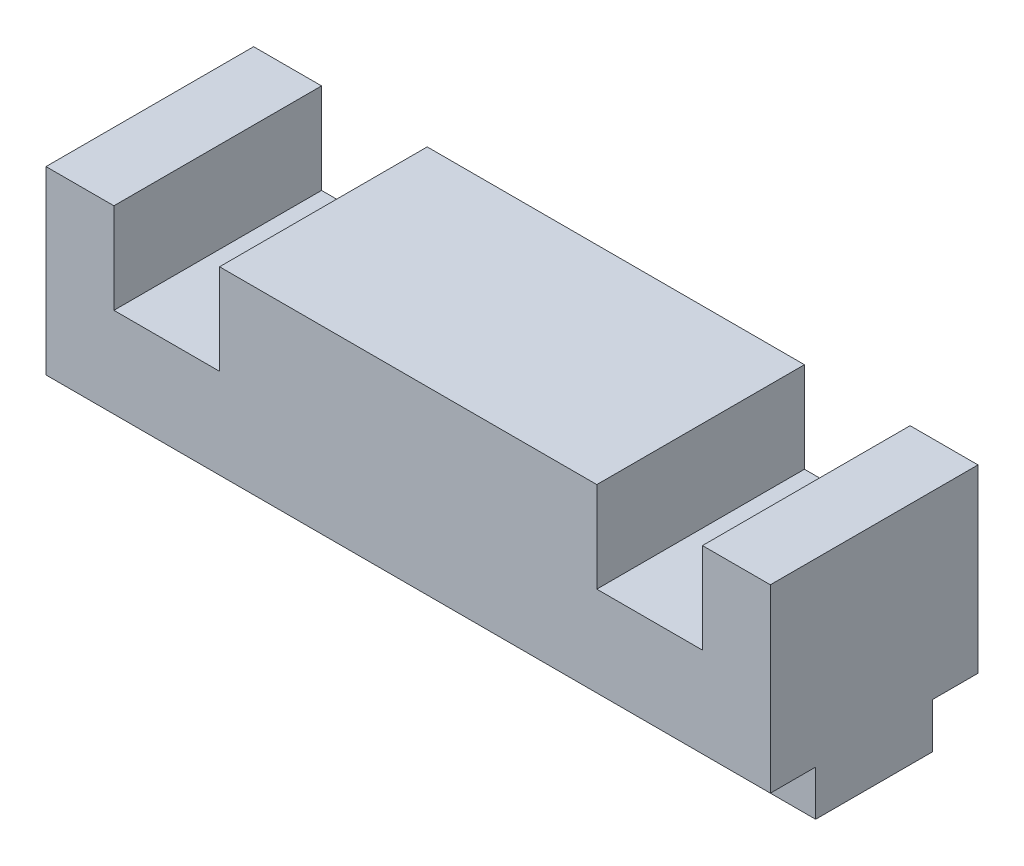
ISO-10303-21;
HEADER;
FILE_DESCRIPTION(('STEP AP214'),'2;1');
FILE_NAME('part.step','',(''),(''),'','','');
FILE_SCHEMA(('AUTOMOTIVE_DESIGN { 1 0 10303 214 1 1 1 1 }'));
ENDSEC;
DATA;
#1=APPLICATION_CONTEXT('core data for automotive mechanical design processes');
#2=APPLICATION_PROTOCOL_DEFINITION('international standard','automotive_design',2000,#1);
#3=PRODUCT_CONTEXT('',#1,'mechanical');
#4=PRODUCT('Part','Part','',(#3));
#5=PRODUCT_RELATED_PRODUCT_CATEGORY('part','',(#4));
#6=PRODUCT_DEFINITION_FORMATION('','',#4);
#7=PRODUCT_DEFINITION_CONTEXT('part definition',#1,'design');
#8=PRODUCT_DEFINITION('design','',#6,#7);
#9=PRODUCT_DEFINITION_SHAPE('','',#8);
#10=(LENGTH_UNIT() NAMED_UNIT(*) SI_UNIT(.MILLI.,.METRE.));
#11=(NAMED_UNIT(*) PLANE_ANGLE_UNIT() SI_UNIT($,.RADIAN.));
#12=(NAMED_UNIT(*) SI_UNIT($,.STERADIAN.) SOLID_ANGLE_UNIT());
#13=UNCERTAINTY_MEASURE_WITH_UNIT(LENGTH_MEASURE(1.E-05),#10,'distance_accuracy_value','');
#14=(GEOMETRIC_REPRESENTATION_CONTEXT(3) GLOBAL_UNCERTAINTY_ASSIGNED_CONTEXT((#13)) GLOBAL_UNIT_ASSIGNED_CONTEXT((#10,
#11,#12)) REPRESENTATION_CONTEXT('',''));
#15=CARTESIAN_POINT('',(0.,0.,0.));
#16=DIRECTION('',(0.,0.,1.));
#17=DIRECTION('',(1.,0.,0.));
#18=AXIS2_PLACEMENT_3D('',#15,#16,#17);
#19=CARTESIAN_POINT('',(0.,23.749,0.));
#20=DIRECTION('',(0.,-1.,0.));
#21=DIRECTION('',(0.,0.,-1.));
#22=AXIS2_PLACEMENT_3D('',#19,#20,#21);
#23=PLANE('',#22);
#24=DIRECTION('',(-1.,0.,0.));
#25=VECTOR('',#24,1.);
#26=CARTESIAN_POINT('',(-38.1,23.749,-10.922));
#27=LINE('',#26,#25);
#28=CARTESIAN_POINT('',(38.1,23.749,-10.922));
#29=VERTEX_POINT('',#28);
#30=CARTESIAN_POINT('',(30.95625,23.749,-10.922));
#31=VERTEX_POINT('',#30);
#32=EDGE_CURVE('E164',#29,#31,#27,.T.);
#33=ORIENTED_EDGE('',*,*,#32,.T.);
#34=DIRECTION('',(0.,0.,1.));
#35=VECTOR('',#34,1.);
#36=CARTESIAN_POINT('',(30.95625,23.749,-10.922));
#37=LINE('',#36,#35);
#38=CARTESIAN_POINT('',(30.95625,23.749,10.922));
#39=VERTEX_POINT('',#38);
#40=EDGE_CURVE('E149',#31,#39,#37,.T.);
#41=ORIENTED_EDGE('',*,*,#40,.T.);
#42=DIRECTION('',(1.,0.,0.));
#43=VECTOR('',#42,1.);
#44=CARTESIAN_POINT('',(-38.1,23.749,10.922));
#45=LINE('',#44,#43);
#46=CARTESIAN_POINT('',(38.1,23.749,10.922));
#47=VERTEX_POINT('',#46);
#48=EDGE_CURVE('E176',#39,#47,#45,.T.);
#49=ORIENTED_EDGE('',*,*,#48,.T.);
#50=DIRECTION('',(0.,0.,-1.));
#51=VECTOR('',#50,1.);
#52=CARTESIAN_POINT('',(38.1,23.749,10.922));
#53=LINE('',#52,#51);
#54=EDGE_CURVE('E170',#47,#29,#53,.T.);
#55=ORIENTED_EDGE('',*,*,#54,.T.);
#56=EDGE_LOOP('',(#33,#41,#49,#55));
#57=FACE_BOUND('',#56,.T.);
#58=ADVANCED_FACE('F33',(#57),#23,.F.);
#59=CARTESIAN_POINT('',(-38.1,23.749,10.922));
#60=VERTEX_POINT('',#59);
#61=CARTESIAN_POINT('',(-30.95625,23.749,10.922));
#62=VERTEX_POINT('',#61);
#63=EDGE_CURVE('E283',#60,#62,#45,.T.);
#64=ORIENTED_EDGE('',*,*,#63,.T.);
#65=DIRECTION('',(0.,0.,1.));
#66=VECTOR('',#65,1.);
#67=CARTESIAN_POINT('',(-30.95625,23.749,-10.922));
#68=LINE('',#67,#66);
#69=CARTESIAN_POINT('',(-30.95625,23.749,-10.922));
#70=VERTEX_POINT('',#69);
#71=EDGE_CURVE('E236',#70,#62,#68,.T.);
#72=ORIENTED_EDGE('',*,*,#71,.F.);
#73=CARTESIAN_POINT('',(-38.1,23.749,-10.922));
#74=VERTEX_POINT('',#73);
#75=EDGE_CURVE('E175',#70,#74,#27,.T.);
#76=ORIENTED_EDGE('',*,*,#75,.T.);
#77=DIRECTION('',(0.,0.,1.));
#78=VECTOR('',#77,1.);
#79=CARTESIAN_POINT('',(-38.1,23.749,10.922));
#80=LINE('',#79,#78);
#81=EDGE_CURVE('E172',#74,#60,#80,.T.);
#82=ORIENTED_EDGE('',*,*,#81,.T.);
#83=EDGE_LOOP('',(#64,#72,#76,#82));
#84=FACE_BOUND('',#83,.T.);
#85=ADVANCED_FACE('F316',(#84),#23,.F.);
#86=CARTESIAN_POINT('',(-38.1,23.749,-10.922));
#87=DIRECTION('',(0.,0.,1.));
#88=DIRECTION('',(1.,0.,0.));
#89=AXIS2_PLACEMENT_3D('',#86,#87,#88);
#90=PLANE('',#89);
#91=DIRECTION('',(1.,0.,0.));
#92=VECTOR('',#91,1.);
#93=CARTESIAN_POINT('',(30.95625,14.224,-10.922));
#94=LINE('',#93,#92);
#95=CARTESIAN_POINT('',(19.84375,14.224,-10.922));
#96=VERTEX_POINT('',#95);
#97=CARTESIAN_POINT('',(30.95625,14.224,-10.922));
#98=VERTEX_POINT('',#97);
#99=EDGE_CURVE('E160',#96,#98,#94,.T.);
#100=ORIENTED_EDGE('',*,*,#99,.T.);
#101=DIRECTION('',(0.,1.,0.));
#102=VECTOR('',#101,1.);
#103=CARTESIAN_POINT('',(30.95625,23.749,-10.922));
#104=LINE('',#103,#102);
#105=EDGE_CURVE('E152',#98,#31,#104,.T.);
#106=ORIENTED_EDGE('',*,*,#105,.T.);
#107=ORIENTED_EDGE('',*,*,#32,.F.);
#108=DIRECTION('',(0.,-1.,0.));
#109=VECTOR('',#108,1.);
#110=CARTESIAN_POINT('',(38.1,23.749,-10.922));
#111=LINE('',#110,#109);
#112=CARTESIAN_POINT('',(38.1,4.7625,-10.922));
#113=VERTEX_POINT('',#112);
#114=EDGE_CURVE('E11',#29,#113,#111,.T.);
#115=ORIENTED_EDGE('',*,*,#114,.T.);
#116=DIRECTION('',(1.,0.,0.));
#117=VECTOR('',#116,1.);
#118=CARTESIAN_POINT('',(-38.1,4.7625,-10.922));
#119=LINE('',#118,#117);
#120=CARTESIAN_POINT('',(-38.1,4.7625,-10.922));
#121=VERTEX_POINT('',#120);
#122=EDGE_CURVE('E219',#121,#113,#119,.T.);
#123=ORIENTED_EDGE('',*,*,#122,.F.);
#124=DIRECTION('',(0.,-1.,0.));
#125=VECTOR('',#124,1.);
#126=CARTESIAN_POINT('',(-38.1,23.749,-10.922));
#127=LINE('',#126,#125);
#128=EDGE_CURVE('E42',#74,#121,#127,.T.);
#129=ORIENTED_EDGE('',*,*,#128,.F.);
#130=ORIENTED_EDGE('',*,*,#75,.F.);
#131=DIRECTION('',(0.,-1.,0.));
#132=VECTOR('',#131,1.);
#133=CARTESIAN_POINT('',(-30.95625,23.749,-10.922));
#134=LINE('',#133,#132);
#135=CARTESIAN_POINT('',(-30.95625,14.224,-10.922));
#136=VERTEX_POINT('',#135);
#137=EDGE_CURVE('E239',#70,#136,#134,.T.);
#138=ORIENTED_EDGE('',*,*,#137,.T.);
#139=DIRECTION('',(1.,0.,0.));
#140=VECTOR('',#139,1.);
#141=CARTESIAN_POINT('',(-30.95625,14.224,-10.922));
#142=LINE('',#141,#140);
#143=CARTESIAN_POINT('',(-19.84375,14.224,-10.922));
#144=VERTEX_POINT('',#143);
#145=EDGE_CURVE('E248',#136,#144,#142,.T.);
#146=ORIENTED_EDGE('',*,*,#145,.T.);
#147=DIRECTION('',(0.,1.,0.));
#148=VECTOR('',#147,1.);
#149=CARTESIAN_POINT('',(-19.84375,23.749,-10.922));
#150=LINE('',#149,#148);
#151=CARTESIAN_POINT('',(-19.84375,23.749,-10.922));
#152=VERTEX_POINT('',#151);
#153=EDGE_CURVE('E232',#144,#152,#150,.T.);
#154=ORIENTED_EDGE('',*,*,#153,.T.);
#155=CARTESIAN_POINT('',(19.84375,23.749,-10.922));
#156=VERTEX_POINT('',#155);
#157=EDGE_CURVE('E173',#156,#152,#27,.T.);
#158=ORIENTED_EDGE('',*,*,#157,.F.);
#159=DIRECTION('',(0.,-1.,0.));
#160=VECTOR('',#159,1.);
#161=CARTESIAN_POINT('',(19.84375,23.749,-10.922));
#162=LINE('',#161,#160);
#163=EDGE_CURVE('E50',#156,#96,#162,.T.);
#164=ORIENTED_EDGE('',*,*,#163,.T.);
#165=EDGE_LOOP('',(#100,#106,#107,#115,#123,#129,#130,#138,#146,#154,#158,#164));
#166=FACE_BOUND('',#165,.T.);
#167=ADVANCED_FACE('F163',(#166),#90,.F.);
#168=CARTESIAN_POINT('',(-38.1,23.749,10.922));
#169=DIRECTION('',(0.,0.,-1.));
#170=DIRECTION('',(-1.,0.,0.));
#171=AXIS2_PLACEMENT_3D('',#168,#169,#170);
#172=PLANE('',#171);
#173=ORIENTED_EDGE('',*,*,#48,.F.);
#174=DIRECTION('',(0.,1.,0.));
#175=VECTOR('',#174,1.);
#176=CARTESIAN_POINT('',(30.95625,23.749,10.922));
#177=LINE('',#176,#175);
#178=CARTESIAN_POINT('',(30.95625,14.224,10.922));
#179=VERTEX_POINT('',#178);
#180=EDGE_CURVE('E155',#179,#39,#177,.T.);
#181=ORIENTED_EDGE('',*,*,#180,.F.);
#182=DIRECTION('',(1.,0.,0.));
#183=VECTOR('',#182,1.);
#184=CARTESIAN_POINT('',(30.95625,14.224,10.922));
#185=LINE('',#184,#183);
#186=CARTESIAN_POINT('',(19.84375,14.224,10.922));
#187=VERTEX_POINT('',#186);
#188=EDGE_CURVE('E167',#187,#179,#185,.T.);
#189=ORIENTED_EDGE('',*,*,#188,.F.);
#190=DIRECTION('',(0.,-1.,0.));
#191=VECTOR('',#190,1.);
#192=CARTESIAN_POINT('',(19.84375,23.749,10.922));
#193=LINE('',#192,#191);
#194=CARTESIAN_POINT('',(19.84375,23.749,10.922));
#195=VERTEX_POINT('',#194);
#196=EDGE_CURVE('E260',#195,#187,#193,.T.);
#197=ORIENTED_EDGE('',*,*,#196,.F.);
#198=CARTESIAN_POINT('',(-19.84375,23.749,10.922));
#199=VERTEX_POINT('',#198);
#200=EDGE_CURVE('E281',#199,#195,#45,.T.);
#201=ORIENTED_EDGE('',*,*,#200,.F.);
#202=DIRECTION('',(0.,1.,0.));
#203=VECTOR('',#202,1.);
#204=CARTESIAN_POINT('',(-19.84375,23.749,10.922));
#205=LINE('',#204,#203);
#206=CARTESIAN_POINT('',(-19.84375,14.224,10.922));
#207=VERTEX_POINT('',#206);
#208=EDGE_CURVE('E58',#207,#199,#205,.T.);
#209=ORIENTED_EDGE('',*,*,#208,.F.);
#210=DIRECTION('',(1.,0.,0.));
#211=VECTOR('',#210,1.);
#212=CARTESIAN_POINT('',(-30.95625,14.224,10.922));
#213=LINE('',#212,#211);
#214=CARTESIAN_POINT('',(-30.95625,14.224,10.922));
#215=VERTEX_POINT('',#214);
#216=EDGE_CURVE('E240',#215,#207,#213,.T.);
#217=ORIENTED_EDGE('',*,*,#216,.F.);
#218=DIRECTION('',(0.,-1.,0.));
#219=VECTOR('',#218,1.);
#220=CARTESIAN_POINT('',(-30.95625,23.749,10.922));
#221=LINE('',#220,#219);
#222=EDGE_CURVE('E243',#62,#215,#221,.T.);
#223=ORIENTED_EDGE('',*,*,#222,.F.);
#224=ORIENTED_EDGE('',*,*,#63,.F.);
#225=DIRECTION('',(0.,-1.,0.));
#226=VECTOR('',#225,1.);
#227=CARTESIAN_POINT('',(-38.1,23.749,10.922));
#228=LINE('',#227,#226);
#229=CARTESIAN_POINT('',(-38.1,4.7625,10.922));
#230=VERTEX_POINT('',#229);
#231=EDGE_CURVE('E292',#60,#230,#228,.T.);
#232=ORIENTED_EDGE('',*,*,#231,.T.);
#233=DIRECTION('',(-1.,0.,0.));
#234=VECTOR('',#233,1.);
#235=CARTESIAN_POINT('',(-38.1,4.7625,10.922));
#236=LINE('',#235,#234);
#237=CARTESIAN_POINT('',(38.1,4.7625,10.922));
#238=VERTEX_POINT('',#237);
#239=EDGE_CURVE('E197',#238,#230,#236,.T.);
#240=ORIENTED_EDGE('',*,*,#239,.F.);
#241=DIRECTION('',(0.,-1.,0.));
#242=VECTOR('',#241,1.);
#243=CARTESIAN_POINT('',(38.1,23.749,10.922));
#244=LINE('',#243,#242);
#245=EDGE_CURVE('E286',#47,#238,#244,.T.);
#246=ORIENTED_EDGE('',*,*,#245,.F.);
#247=EDGE_LOOP('',(#173,#181,#189,#197,#201,#209,#217,#223,#224,#232,#240,#246));
#248=FACE_BOUND('',#247,.T.);
#249=ADVANCED_FACE('F279',(#248),#172,.F.);
#250=ORIENTED_EDGE('',*,*,#200,.T.);
#251=DIRECTION('',(0.,0.,1.));
#252=VECTOR('',#251,1.);
#253=CARTESIAN_POINT('',(19.84375,23.749,-10.922));
#254=LINE('',#253,#252);
#255=EDGE_CURVE('E159',#156,#195,#254,.T.);
#256=ORIENTED_EDGE('',*,*,#255,.F.);
#257=ORIENTED_EDGE('',*,*,#157,.T.);
#258=DIRECTION('',(0.,0.,1.));
#259=VECTOR('',#258,1.);
#260=CARTESIAN_POINT('',(-19.84375,23.749,-10.922));
#261=LINE('',#260,#259);
#262=EDGE_CURVE('E234',#152,#199,#261,.T.);
#263=ORIENTED_EDGE('',*,*,#262,.T.);
#264=EDGE_LOOP('',(#250,#256,#257,#263));
#265=FACE_BOUND('',#264,.T.);
#266=ADVANCED_FACE('F269',(#265),#23,.F.);
#267=CARTESIAN_POINT('',(38.1,23.749,10.922));
#268=DIRECTION('',(-1.,0.,0.));
#269=DIRECTION('',(0.,0.,1.));
#270=AXIS2_PLACEMENT_3D('',#267,#268,#269);
#271=PLANE('',#270);
#272=DIRECTION('',(0.,0.,-1.));
#273=VECTOR('',#272,1.);
#274=CARTESIAN_POINT('',(38.1,0.,10.922));
#275=LINE('',#274,#273);
#276=CARTESIAN_POINT('',(38.1,0.,6.1595));
#277=VERTEX_POINT('',#276);
#278=CARTESIAN_POINT('',(38.1,0.,-6.1595));
#279=VERTEX_POINT('',#278);
#280=EDGE_CURVE('E184',#277,#279,#275,.T.);
#281=ORIENTED_EDGE('',*,*,#280,.T.);
#282=DIRECTION('',(0.,-1.,0.));
#283=VECTOR('',#282,1.);
#284=CARTESIAN_POINT('',(38.1,4.7625,-6.1595));
#285=LINE('',#284,#283);
#286=CARTESIAN_POINT('',(38.1,4.7625,-6.1595));
#287=VERTEX_POINT('',#286);
#288=EDGE_CURVE('E212',#287,#279,#285,.T.);
#289=ORIENTED_EDGE('',*,*,#288,.F.);
#290=DIRECTION('',(0.,0.,1.));
#291=VECTOR('',#290,1.);
#292=CARTESIAN_POINT('',(38.1,4.7625,-10.922));
#293=LINE('',#292,#291);
#294=EDGE_CURVE('E225',#113,#287,#293,.T.);
#295=ORIENTED_EDGE('',*,*,#294,.F.);
#296=ORIENTED_EDGE('',*,*,#114,.F.);
#297=ORIENTED_EDGE('',*,*,#54,.F.);
#298=ORIENTED_EDGE('',*,*,#245,.T.);
#299=DIRECTION('',(0.,0.,1.));
#300=VECTOR('',#299,1.);
#301=CARTESIAN_POINT('',(38.1,4.7625,10.922));
#302=LINE('',#301,#300);
#303=CARTESIAN_POINT('',(38.1,4.7625,6.1595));
#304=VERTEX_POINT('',#303);
#305=EDGE_CURVE('E205',#304,#238,#302,.T.);
#306=ORIENTED_EDGE('',*,*,#305,.F.);
#307=DIRECTION('',(0.,-1.,0.));
#308=VECTOR('',#307,1.);
#309=CARTESIAN_POINT('',(38.1,4.7625,6.1595));
#310=LINE('',#309,#308);
#311=EDGE_CURVE('E193',#304,#277,#310,.T.);
#312=ORIENTED_EDGE('',*,*,#311,.T.);
#313=EDGE_LOOP('',(#281,#289,#295,#296,#297,#298,#306,#312));
#314=FACE_BOUND('',#313,.T.);
#315=ADVANCED_FACE('F35',(#314),#271,.F.);
#316=CARTESIAN_POINT('',(-38.1,23.749,10.922));
#317=DIRECTION('',(1.,0.,0.));
#318=DIRECTION('',(0.,0.,-1.));
#319=AXIS2_PLACEMENT_3D('',#316,#317,#318);
#320=PLANE('',#319);
#321=DIRECTION('',(0.,0.,-1.));
#322=VECTOR('',#321,1.);
#323=CARTESIAN_POINT('',(-38.1,4.7625,-10.922));
#324=LINE('',#323,#322);
#325=CARTESIAN_POINT('',(-38.1,4.7625,-6.1595));
#326=VERTEX_POINT('',#325);
#327=EDGE_CURVE('E214',#326,#121,#324,.T.);
#328=ORIENTED_EDGE('',*,*,#327,.F.);
#329=DIRECTION('',(0.,-1.,0.));
#330=VECTOR('',#329,1.);
#331=CARTESIAN_POINT('',(-38.1,4.7625,-6.1595));
#332=LINE('',#331,#330);
#333=CARTESIAN_POINT('',(-38.1,0.,-6.1595));
#334=VERTEX_POINT('',#333);
#335=EDGE_CURVE('E203',#326,#334,#332,.T.);
#336=ORIENTED_EDGE('',*,*,#335,.T.);
#337=DIRECTION('',(0.,0.,1.));
#338=VECTOR('',#337,1.);
#339=CARTESIAN_POINT('',(-38.1,0.,10.922));
#340=LINE('',#339,#338);
#341=CARTESIAN_POINT('',(-38.1,0.,6.1595));
#342=VERTEX_POINT('',#341);
#343=EDGE_CURVE('E183',#334,#342,#340,.T.);
#344=ORIENTED_EDGE('',*,*,#343,.T.);
#345=DIRECTION('',(0.,-1.,0.));
#346=VECTOR('',#345,1.);
#347=CARTESIAN_POINT('',(-38.1,4.7625,6.1595));
#348=LINE('',#347,#346);
#349=CARTESIAN_POINT('',(-38.1,4.7625,6.1595));
#350=VERTEX_POINT('',#349);
#351=EDGE_CURVE('E194',#350,#342,#348,.T.);
#352=ORIENTED_EDGE('',*,*,#351,.F.);
#353=DIRECTION('',(0.,0.,-1.));
#354=VECTOR('',#353,1.);
#355=CARTESIAN_POINT('',(-38.1,4.7625,10.922));
#356=LINE('',#355,#354);
#357=EDGE_CURVE('E202',#230,#350,#356,.T.);
#358=ORIENTED_EDGE('',*,*,#357,.F.);
#359=ORIENTED_EDGE('',*,*,#231,.F.);
#360=ORIENTED_EDGE('',*,*,#81,.F.);
#361=ORIENTED_EDGE('',*,*,#128,.T.);
#362=EDGE_LOOP('',(#328,#336,#344,#352,#358,#359,#360,#361));
#363=FACE_BOUND('',#362,.T.);
#364=ADVANCED_FACE('F328',(#363),#320,.F.);
#365=CARTESIAN_POINT('',(0.,0.,0.));
#366=DIRECTION('',(0.,-1.,0.));
#367=DIRECTION('',(0.,0.,-1.));
#368=AXIS2_PLACEMENT_3D('',#365,#366,#367);
#369=PLANE('',#368);
#370=DIRECTION('',(-1.,0.,0.));
#371=VECTOR('',#370,1.);
#372=CARTESIAN_POINT('',(-38.1,0.,-6.1595));
#373=LINE('',#372,#371);
#374=EDGE_CURVE('E217',#279,#334,#373,.T.);
#375=ORIENTED_EDGE('',*,*,#374,.F.);
#376=ORIENTED_EDGE('',*,*,#280,.F.);
#377=DIRECTION('',(1.,0.,0.));
#378=VECTOR('',#377,1.);
#379=CARTESIAN_POINT('',(-38.1,0.,6.1595));
#380=LINE('',#379,#378);
#381=EDGE_CURVE('E200',#342,#277,#380,.T.);
#382=ORIENTED_EDGE('',*,*,#381,.F.);
#383=ORIENTED_EDGE('',*,*,#343,.F.);
#384=EDGE_LOOP('',(#375,#376,#382,#383));
#385=FACE_BOUND('',#384,.T.);
#386=CARTESIAN_POINT('',(-25.4,0.,0.));
#387=DIRECTION('',(0.,-1.,0.));
#388=DIRECTION('',(0.,0.,-1.));
#389=AXIS2_PLACEMENT_3D('',#386,#387,#388);
#390=CIRCLE('',#389,3.37819999999999);
#391=CARTESIAN_POINT('',(-25.4,0.,-3.37819999999999));
#392=VERTEX_POINT('',#391);
#393=EDGE_CURVE('E190',#392,#392,#390,.T.);
#394=ORIENTED_EDGE('',*,*,#393,.F.);
#395=EDGE_LOOP('',(#394));
#396=FACE_BOUND('',#395,.T.);
#397=CARTESIAN_POINT('',(25.4,0.,0.));
#398=DIRECTION('',(0.,-1.,0.));
#399=DIRECTION('',(0.,0.,-1.));
#400=AXIS2_PLACEMENT_3D('',#397,#398,#399);
#401=CIRCLE('',#400,3.37819999999999);
#402=CARTESIAN_POINT('',(25.4,0.,-3.37819999999999));
#403=VERTEX_POINT('',#402);
#404=EDGE_CURVE('E187',#403,#403,#401,.T.);
#405=ORIENTED_EDGE('',*,*,#404,.F.);
#406=EDGE_LOOP('',(#405));
#407=FACE_BOUND('',#406,.T.);
#408=ADVANCED_FACE('F335',(#385,#396,#407),#369,.T.);
#409=CARTESIAN_POINT('',(25.4,23.749,0.));
#410=DIRECTION('',(0.,1.,0.));
#411=DIRECTION('',(0.,0.,1.));
#412=AXIS2_PLACEMENT_3D('',#409,#410,#411);
#413=CYLINDRICAL_SURFACE('',#412,3.37819999999999);
#414=CARTESIAN_POINT('',(25.4,14.224,0.));
#415=DIRECTION('',(0.,-1.,0.));
#416=DIRECTION('',(1.,0.,0.));
#417=AXIS2_PLACEMENT_3D('',#414,#415,#416);
#418=CIRCLE('',#417,3.37819999999999);
#419=CARTESIAN_POINT('',(28.7782,14.224,0.));
#420=VERTEX_POINT('',#419);
#421=EDGE_CURVE('E37',#420,#420,#418,.F.);
#422=ORIENTED_EDGE('',*,*,#421,.T.);
#423=EDGE_LOOP('',(#422));
#424=FACE_BOUND('',#423,.T.);
#425=ORIENTED_EDGE('',*,*,#404,.T.);
#426=EDGE_LOOP('',(#425));
#427=FACE_BOUND('',#426,.T.);
#428=ADVANCED_FACE('F341',(#424,#427),#413,.F.);
#429=CARTESIAN_POINT('',(-25.4,23.749,0.));
#430=DIRECTION('',(0.,1.,0.));
#431=DIRECTION('',(0.,0.,1.));
#432=AXIS2_PLACEMENT_3D('',#429,#430,#431);
#433=CYLINDRICAL_SURFACE('',#432,3.37819999999999);
#434=CARTESIAN_POINT('',(-25.4,14.224,0.));
#435=DIRECTION('',(0.,-1.,0.));
#436=DIRECTION('',(1.,0.,0.));
#437=AXIS2_PLACEMENT_3D('',#434,#435,#436);
#438=CIRCLE('',#437,3.37819999999999);
#439=CARTESIAN_POINT('',(-22.0218,14.224,0.));
#440=VERTEX_POINT('',#439);
#441=EDGE_CURVE('E220',#440,#440,#438,.F.);
#442=ORIENTED_EDGE('',*,*,#441,.T.);
#443=EDGE_LOOP('',(#442));
#444=FACE_BOUND('',#443,.T.);
#445=ORIENTED_EDGE('',*,*,#393,.T.);
#446=EDGE_LOOP('',(#445));
#447=FACE_BOUND('',#446,.T.);
#448=ADVANCED_FACE('F299',(#444,#447),#433,.F.);
#449=CARTESIAN_POINT('',(-38.1,4.7625,6.1595));
#450=DIRECTION('',(0.,0.,-1.));
#451=DIRECTION('',(-1.,0.,0.));
#452=AXIS2_PLACEMENT_3D('',#449,#450,#451);
#453=PLANE('',#452);
#454=ORIENTED_EDGE('',*,*,#381,.T.);
#455=ORIENTED_EDGE('',*,*,#311,.F.);
#456=DIRECTION('',(1.,0.,0.));
#457=VECTOR('',#456,1.);
#458=CARTESIAN_POINT('',(-38.1,4.7625,6.1595));
#459=LINE('',#458,#457);
#460=EDGE_CURVE('E207',#350,#304,#459,.T.);
#461=ORIENTED_EDGE('',*,*,#460,.F.);
#462=ORIENTED_EDGE('',*,*,#351,.T.);
#463=EDGE_LOOP('',(#454,#455,#461,#462));
#464=FACE_BOUND('',#463,.T.);
#465=ADVANCED_FACE('F357',(#464),#453,.F.);
#466=CARTESIAN_POINT('',(0.,4.7625,0.));
#467=DIRECTION('',(0.,-1.,0.));
#468=DIRECTION('',(0.,0.,-1.));
#469=AXIS2_PLACEMENT_3D('',#466,#467,#468);
#470=PLANE('',#469);
#471=ORIENTED_EDGE('',*,*,#357,.T.);
#472=ORIENTED_EDGE('',*,*,#460,.T.);
#473=ORIENTED_EDGE('',*,*,#305,.T.);
#474=ORIENTED_EDGE('',*,*,#239,.T.);
#475=EDGE_LOOP('',(#471,#472,#473,#474));
#476=FACE_BOUND('',#475,.T.);
#477=ADVANCED_FACE('F360',(#476),#470,.T.);
#478=CARTESIAN_POINT('',(-38.1,4.7625,-6.1595));
#479=DIRECTION('',(0.,0.,1.));
#480=DIRECTION('',(1.,0.,0.));
#481=AXIS2_PLACEMENT_3D('',#478,#479,#480);
#482=PLANE('',#481);
#483=ORIENTED_EDGE('',*,*,#374,.T.);
#484=ORIENTED_EDGE('',*,*,#335,.F.);
#485=DIRECTION('',(-1.,0.,0.));
#486=VECTOR('',#485,1.);
#487=CARTESIAN_POINT('',(-38.1,4.7625,-6.1595));
#488=LINE('',#487,#486);
#489=EDGE_CURVE('E222',#287,#326,#488,.T.);
#490=ORIENTED_EDGE('',*,*,#489,.F.);
#491=ORIENTED_EDGE('',*,*,#288,.T.);
#492=EDGE_LOOP('',(#483,#484,#490,#491));
#493=FACE_BOUND('',#492,.T.);
#494=ADVANCED_FACE('F311',(#493),#482,.F.);
#495=CARTESIAN_POINT('',(0.,4.7625,0.));
#496=DIRECTION('',(0.,-1.,0.));
#497=DIRECTION('',(0.,0.,-1.));
#498=AXIS2_PLACEMENT_3D('',#495,#496,#497);
#499=PLANE('',#498);
#500=ORIENTED_EDGE('',*,*,#122,.T.);
#501=ORIENTED_EDGE('',*,*,#294,.T.);
#502=ORIENTED_EDGE('',*,*,#489,.T.);
#503=ORIENTED_EDGE('',*,*,#327,.T.);
#504=EDGE_LOOP('',(#500,#501,#502,#503));
#505=FACE_BOUND('',#504,.T.);
#506=ADVANCED_FACE('F303',(#505),#499,.T.);
#507=CARTESIAN_POINT('',(-30.95625,14.224,-10.922));
#508=DIRECTION('',(0.,-1.,0.));
#509=DIRECTION('',(1.,0.,0.));
#510=AXIS2_PLACEMENT_3D('',#507,#508,#509);
#511=PLANE('',#510);
#512=ORIENTED_EDGE('',*,*,#216,.T.);
#513=DIRECTION('',(0.,0.,1.));
#514=VECTOR('',#513,1.);
#515=CARTESIAN_POINT('',(-19.84375,14.224,-10.922));
#516=LINE('',#515,#514);
#517=EDGE_CURVE('E231',#144,#207,#516,.T.);
#518=ORIENTED_EDGE('',*,*,#517,.F.);
#519=ORIENTED_EDGE('',*,*,#145,.F.);
#520=DIRECTION('',(0.,0.,1.));
#521=VECTOR('',#520,1.);
#522=CARTESIAN_POINT('',(-30.95625,14.224,-10.922));
#523=LINE('',#522,#521);
#524=EDGE_CURVE('E229',#136,#215,#523,.T.);
#525=ORIENTED_EDGE('',*,*,#524,.T.);
#526=EDGE_LOOP('',(#512,#518,#519,#525));
#527=FACE_BOUND('',#526,.T.);
#528=ORIENTED_EDGE('',*,*,#441,.F.);
#529=EDGE_LOOP('',(#528));
#530=FACE_BOUND('',#529,.T.);
#531=ADVANCED_FACE('F274',(#527,#530),#511,.F.);
#532=CARTESIAN_POINT('',(-30.95625,23.749,-10.922));
#533=DIRECTION('',(-1.,0.,0.));
#534=DIRECTION('',(0.,-1.,0.));
#535=AXIS2_PLACEMENT_3D('',#532,#533,#534);
#536=PLANE('',#535);
#537=ORIENTED_EDGE('',*,*,#222,.T.);
#538=ORIENTED_EDGE('',*,*,#524,.F.);
#539=ORIENTED_EDGE('',*,*,#137,.F.);
#540=ORIENTED_EDGE('',*,*,#71,.T.);
#541=EDGE_LOOP('',(#537,#538,#539,#540));
#542=FACE_BOUND('',#541,.T.);
#543=ADVANCED_FACE('F302',(#542),#536,.F.);
#544=CARTESIAN_POINT('',(-19.84375,23.749,-10.922));
#545=DIRECTION('',(1.,0.,0.));
#546=DIRECTION('',(0.,1.,0.));
#547=AXIS2_PLACEMENT_3D('',#544,#545,#546);
#548=PLANE('',#547);
#549=ORIENTED_EDGE('',*,*,#208,.T.);
#550=ORIENTED_EDGE('',*,*,#262,.F.);
#551=ORIENTED_EDGE('',*,*,#153,.F.);
#552=ORIENTED_EDGE('',*,*,#517,.T.);
#553=EDGE_LOOP('',(#549,#550,#551,#552));
#554=FACE_BOUND('',#553,.T.);
#555=ADVANCED_FACE('F271',(#554),#548,.F.);
#556=CARTESIAN_POINT('',(30.95625,14.224,-10.922));
#557=DIRECTION('',(0.,-1.,0.));
#558=DIRECTION('',(1.,0.,0.));
#559=AXIS2_PLACEMENT_3D('',#556,#557,#558);
#560=PLANE('',#559);
#561=ORIENTED_EDGE('',*,*,#188,.T.);
#562=DIRECTION('',(0.,0.,1.));
#563=VECTOR('',#562,1.);
#564=CARTESIAN_POINT('',(30.95625,14.224,-10.922));
#565=LINE('',#564,#563);
#566=EDGE_CURVE('E256',#98,#179,#565,.T.);
#567=ORIENTED_EDGE('',*,*,#566,.F.);
#568=ORIENTED_EDGE('',*,*,#99,.F.);
#569=DIRECTION('',(0.,0.,1.));
#570=VECTOR('',#569,1.);
#571=CARTESIAN_POINT('',(19.84375,14.224,-10.922));
#572=LINE('',#571,#570);
#573=EDGE_CURVE('E254',#96,#187,#572,.T.);
#574=ORIENTED_EDGE('',*,*,#573,.T.);
#575=EDGE_LOOP('',(#561,#567,#568,#574));
#576=FACE_BOUND('',#575,.T.);
#577=ORIENTED_EDGE('',*,*,#421,.F.);
#578=EDGE_LOOP('',(#577));
#579=FACE_BOUND('',#578,.T.);
#580=ADVANCED_FACE('F366',(#576,#579),#560,.F.);
#581=CARTESIAN_POINT('',(30.95625,23.749,-10.922));
#582=DIRECTION('',(1.,0.,0.));
#583=DIRECTION('',(0.,0.,-1.));
#584=AXIS2_PLACEMENT_3D('',#581,#582,#583);
#585=PLANE('',#584);
#586=ORIENTED_EDGE('',*,*,#180,.T.);
#587=ORIENTED_EDGE('',*,*,#40,.F.);
#588=ORIENTED_EDGE('',*,*,#105,.F.);
#589=ORIENTED_EDGE('',*,*,#566,.T.);
#590=EDGE_LOOP('',(#586,#587,#588,#589));
#591=FACE_BOUND('',#590,.T.);
#592=ADVANCED_FACE('F151',(#591),#585,.F.);
#593=CARTESIAN_POINT('',(19.84375,23.749,-10.922));
#594=DIRECTION('',(-1.,0.,0.));
#595=DIRECTION('',(0.,-1.,0.));
#596=AXIS2_PLACEMENT_3D('',#593,#594,#595);
#597=PLANE('',#596);
#598=ORIENTED_EDGE('',*,*,#196,.T.);
#599=ORIENTED_EDGE('',*,*,#573,.F.);
#600=ORIENTED_EDGE('',*,*,#163,.F.);
#601=ORIENTED_EDGE('',*,*,#255,.T.);
#602=EDGE_LOOP('',(#598,#599,#600,#601));
#603=FACE_BOUND('',#602,.T.);
#604=ADVANCED_FACE('F368',(#603),#597,.F.);
#605=CLOSED_SHELL('',(#58,#85,#167,#249,#266,#315,#364,#408,#428,#448,#465,#477,#494,#506,#531,
#543,#555,#580,#592,#604));
#606=MANIFOLD_SOLID_BREP('B2',#605);
#607=ADVANCED_BREP_SHAPE_REPRESENTATION('',(#18,#606),#14);
#608=SHAPE_DEFINITION_REPRESENTATION(#9,#607);
ENDSEC;
END-ISO-10303-21;
